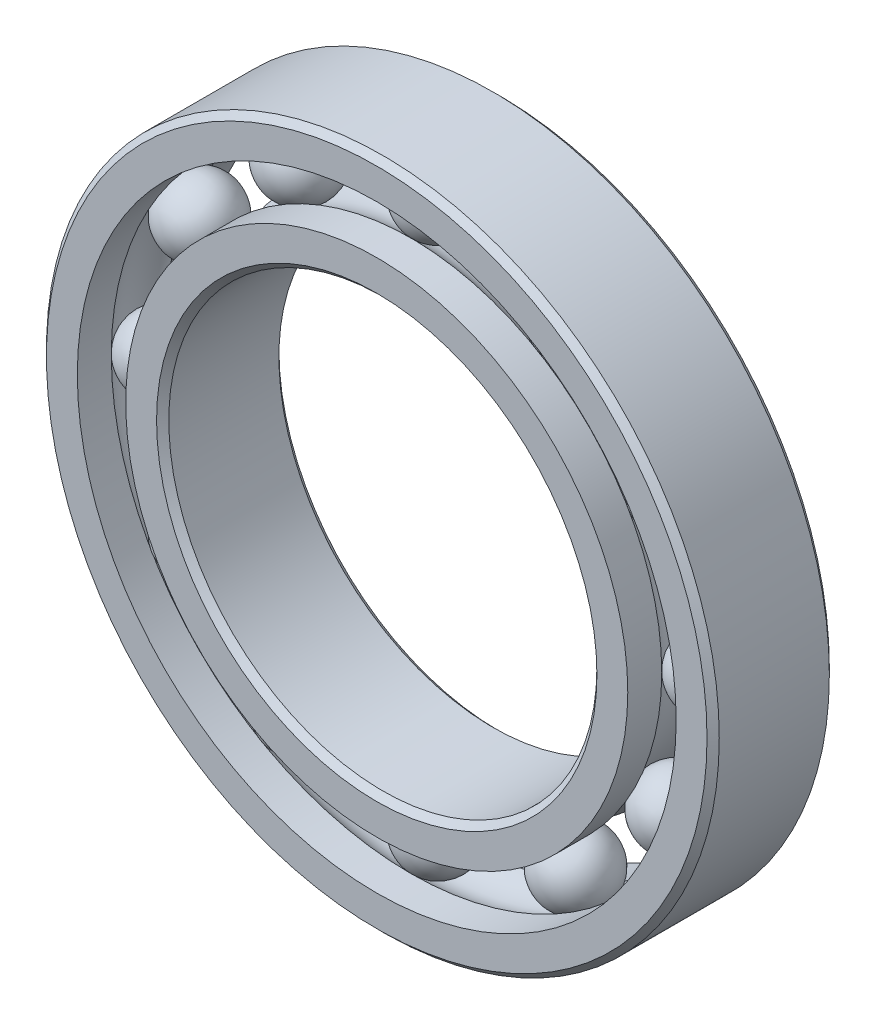
ISO-10303-21;
HEADER;
FILE_DESCRIPTION(('STEP AP214'),'2;1');
FILE_NAME('part.step','',(''),(''),'','','');
FILE_SCHEMA(('AUTOMOTIVE_DESIGN { 1 0 10303 214 1 1 1 1 }'));
ENDSEC;
DATA;
#1=APPLICATION_CONTEXT('core data for automotive mechanical design processes');
#2=APPLICATION_PROTOCOL_DEFINITION('international standard','automotive_design',2000,#1);
#3=PRODUCT_CONTEXT('',#1,'mechanical');
#4=PRODUCT('Part','Part','',(#3));
#5=PRODUCT_RELATED_PRODUCT_CATEGORY('part','',(#4));
#6=PRODUCT_DEFINITION_FORMATION('','',#4);
#7=PRODUCT_DEFINITION_CONTEXT('part definition',#1,'design');
#8=PRODUCT_DEFINITION('design','',#6,#7);
#9=PRODUCT_DEFINITION_SHAPE('','',#8);
#10=(LENGTH_UNIT() NAMED_UNIT(*) SI_UNIT(.MILLI.,.METRE.));
#11=(NAMED_UNIT(*) PLANE_ANGLE_UNIT() SI_UNIT($,.RADIAN.));
#12=(NAMED_UNIT(*) SI_UNIT($,.STERADIAN.) SOLID_ANGLE_UNIT());
#13=UNCERTAINTY_MEASURE_WITH_UNIT(LENGTH_MEASURE(1.E-05),#10,'distance_accuracy_value','');
#14=(GEOMETRIC_REPRESENTATION_CONTEXT(3) GLOBAL_UNCERTAINTY_ASSIGNED_CONTEXT((#13)) GLOBAL_UNIT_ASSIGNED_CONTEXT((#10,
#11,#12)) REPRESENTATION_CONTEXT('',''));
#15=CARTESIAN_POINT('',(0.,0.,0.));
#16=DIRECTION('',(0.,0.,1.));
#17=DIRECTION('',(1.,0.,0.));
#18=AXIS2_PLACEMENT_3D('',#15,#16,#17);
#19=CARTESIAN_POINT('',(-11.2498749999997,19.4853550787991,0.));
#20=DIRECTION('',(0.,0.,1.));
#21=DIRECTION('',(-0.499999999999989,0.866025403784445,0.));
#22=AXIS2_PLACEMENT_3D('',#19,#20,#21);
#23=SPHERICAL_SURFACE('',#22,2.97503656288057);
#24=CARTESIAN_POINT('',(-11.2498749999997,19.4853550787991,2.97503656288057));
#25=VERTEX_POINT('',#24);
#26=VERTEX_LOOP('',#25);
#27=FACE_BOUND('',#26,.T.);
#28=ADVANCED_FACE('F37',(#27),#23,.T.);
#29=CLOSED_SHELL('',(#28));
#30=MANIFOLD_SOLID_BREP('B2',#29);
#31=CARTESIAN_POINT('',(-19.4853550787988,11.2498750000002,0.));
#32=DIRECTION('',(0.,0.,1.));
#33=DIRECTION('',(-0.866025403784433,0.50000000000001,0.));
#34=AXIS2_PLACEMENT_3D('',#31,#32,#33);
#35=SPHERICAL_SURFACE('',#34,2.97503656288057);
#36=CARTESIAN_POINT('',(-19.4853550787988,11.2498750000002,2.97503656288057));
#37=VERTEX_POINT('',#36);
#38=VERTEX_LOOP('',#37);
#39=FACE_BOUND('',#38,.T.);
#40=ADVANCED_FACE('F57',(#39),#35,.T.);
#41=CLOSED_SHELL('',(#40));
#42=MANIFOLD_SOLID_BREP('B6',#41);
#43=CARTESIAN_POINT('',(-22.49975,2.35672371760907E-13,0.));
#44=DIRECTION('',(0.,0.,1.));
#45=DIRECTION('',(-1.,0.,0.));
#46=AXIS2_PLACEMENT_3D('',#43,#44,#45);
#47=SPHERICAL_SURFACE('',#46,2.97503656288057);
#48=CARTESIAN_POINT('',(-22.49975,2.35672371760907E-13,2.97503656288057));
#49=VERTEX_POINT('',#48);
#50=VERTEX_LOOP('',#49);
#51=FACE_BOUND('',#50,.T.);
#52=ADVANCED_FACE('F77',(#51),#47,.T.);
#53=CLOSED_SHELL('',(#52));
#54=MANIFOLD_SOLID_BREP('B33',#53);
#55=CARTESIAN_POINT('',(-19.485355078799,-11.2498749999998,0.));
#56=DIRECTION('',(0.,0.,1.));
#57=DIRECTION('',(-0.866025403784443,-0.499999999999992,0.));
#58=AXIS2_PLACEMENT_3D('',#55,#56,#57);
#59=SPHERICAL_SURFACE('',#58,2.97503656288057);
#60=CARTESIAN_POINT('',(-19.485355078799,-11.2498749999998,2.97503656288057));
#61=VERTEX_POINT('',#60);
#62=VERTEX_LOOP('',#61);
#63=FACE_BOUND('',#62,.T.);
#64=ADVANCED_FACE('F97',(#63),#59,.T.);
#65=CLOSED_SHELL('',(#64));
#66=MANIFOLD_SOLID_BREP('B53',#65);
#67=CARTESIAN_POINT('',(-11.2498750000002,-19.4853550787988,0.));
#68=DIRECTION('',(0.,0.,1.));
#69=DIRECTION('',(-0.500000000000007,-0.866025403784435,0.));
#70=AXIS2_PLACEMENT_3D('',#67,#68,#69);
#71=SPHERICAL_SURFACE('',#70,2.97503656288057);
#72=CARTESIAN_POINT('',(-11.2498750000002,-19.4853550787988,2.97503656288057));
#73=VERTEX_POINT('',#72);
#74=VERTEX_LOOP('',#73);
#75=FACE_BOUND('',#74,.T.);
#76=ADVANCED_FACE('F117',(#75),#71,.T.);
#77=CLOSED_SHELL('',(#76));
#78=MANIFOLD_SOLID_BREP('B73',#77);
#79=CARTESIAN_POINT('',(-1.57114914507272E-13,-22.49975,0.));
#80=DIRECTION('',(0.,0.,1.));
#81=DIRECTION('',(0.,-1.,0.));
#82=AXIS2_PLACEMENT_3D('',#79,#80,#81);
#83=SPHERICAL_SURFACE('',#82,2.97503656288057);
#84=CARTESIAN_POINT('',(-1.57114914507272E-13,-22.49975,2.97503656288057));
#85=VERTEX_POINT('',#84);
#86=VERTEX_LOOP('',#85);
#87=FACE_BOUND('',#86,.T.);
#88=ADVANCED_FACE('F137',(#87),#83,.T.);
#89=CLOSED_SHELL('',(#88));
#90=MANIFOLD_SOLID_BREP('B93',#89);
#91=CARTESIAN_POINT('',(11.2498749999999,-19.485355078799,0.));
#92=DIRECTION('',(0.,0.,1.));
#93=DIRECTION('',(0.499999999999995,-0.866025403784442,0.));
#94=AXIS2_PLACEMENT_3D('',#91,#92,#93);
#95=SPHERICAL_SURFACE('',#94,2.97503656288057);
#96=CARTESIAN_POINT('',(11.2498749999999,-19.485355078799,2.97503656288057));
#97=VERTEX_POINT('',#96);
#98=VERTEX_LOOP('',#97);
#99=FACE_BOUND('',#98,.T.);
#100=ADVANCED_FACE('F157',(#99),#95,.T.);
#101=CLOSED_SHELL('',(#100));
#102=MANIFOLD_SOLID_BREP('B113',#101);
#103=CARTESIAN_POINT('',(19.4853550787989,-11.2498750000001,0.));
#104=DIRECTION('',(0.,0.,1.));
#105=DIRECTION('',(0.866025403784436,-0.500000000000004,0.));
#106=AXIS2_PLACEMENT_3D('',#103,#104,#105);
#107=SPHERICAL_SURFACE('',#106,2.97503656288057);
#108=CARTESIAN_POINT('',(19.4853550787989,-11.2498750000001,2.97503656288057));
#109=VERTEX_POINT('',#108);
#110=VERTEX_LOOP('',#109);
#111=FACE_BOUND('',#110,.T.);
#112=ADVANCED_FACE('F177',(#111),#107,.T.);
#113=CLOSED_SHELL('',(#112));
#114=MANIFOLD_SOLID_BREP('B133',#113);
#115=CARTESIAN_POINT('',(22.49975,0.,0.));
#116=DIRECTION('',(0.,0.,1.));
#117=DIRECTION('',(1.,0.,0.));
#118=AXIS2_PLACEMENT_3D('',#115,#116,#117);
#119=SPHERICAL_SURFACE('',#118,2.97503656288057);
#120=CARTESIAN_POINT('',(22.49975,0.,2.97503656288057));
#121=VERTEX_POINT('',#120);
#122=VERTEX_LOOP('',#121);
#123=FACE_BOUND('',#122,.T.);
#124=ADVANCED_FACE('F197',(#123),#119,.T.);
#125=CLOSED_SHELL('',(#124));
#126=MANIFOLD_SOLID_BREP('B153',#125);
#127=CARTESIAN_POINT('',(19.4853550787989,11.249875,0.));
#128=DIRECTION('',(0.,0.,1.));
#129=DIRECTION('',(0.86602540378444,0.499999999999998,0.));
#130=AXIS2_PLACEMENT_3D('',#127,#128,#129);
#131=SPHERICAL_SURFACE('',#130,2.97503656288057);
#132=CARTESIAN_POINT('',(19.4853550787989,11.249875,2.97503656288057));
#133=VERTEX_POINT('',#132);
#134=VERTEX_LOOP('',#133);
#135=FACE_BOUND('',#134,.T.);
#136=ADVANCED_FACE('F217',(#135),#131,.T.);
#137=CLOSED_SHELL('',(#136));
#138=MANIFOLD_SOLID_BREP('B173',#137);
#139=CARTESIAN_POINT('',(11.249875,19.4853550787989,0.));
#140=DIRECTION('',(0.,0.,1.));
#141=DIRECTION('',(0.500000000000001,0.866025403784438,0.));
#142=AXIS2_PLACEMENT_3D('',#139,#140,#141);
#143=SPHERICAL_SURFACE('',#142,2.97503656288057);
#144=CARTESIAN_POINT('',(11.249875,19.4853550787989,2.97503656288057));
#145=VERTEX_POINT('',#144);
#146=VERTEX_LOOP('',#145);
#147=FACE_BOUND('',#146,.T.);
#148=ADVANCED_FACE('F237',(#147),#143,.T.);
#149=CLOSED_SHELL('',(#148));
#150=MANIFOLD_SOLID_BREP('B193',#149);
#151=CARTESIAN_POINT('',(0.,22.49975,0.));
#152=DIRECTION('',(0.,0.,1.));
#153=DIRECTION('',(0.,1.,0.));
#154=AXIS2_PLACEMENT_3D('',#151,#152,#153);
#155=SPHERICAL_SURFACE('',#154,2.97503656288057);
#156=CARTESIAN_POINT('',(0.,22.49975,2.97503656288057));
#157=VERTEX_POINT('',#156);
#158=VERTEX_LOOP('',#157);
#159=FACE_BOUND('',#158,.T.);
#160=ADVANCED_FACE('F259',(#159),#155,.T.);
#161=CLOSED_SHELL('',(#160));
#162=MANIFOLD_SOLID_BREP('B213',#161);
#163=CARTESIAN_POINT('',(0.,20.521728021978,5.));
#164=DIRECTION('',(0.,0.,-1.));
#165=DIRECTION('',(-1.,0.,0.));
#166=AXIS2_PLACEMENT_3D('',#163,#164,#165);
#167=PLANE('',#166);
#168=CARTESIAN_POINT('',(0.,0.,5.));
#169=DIRECTION('',(0.,0.,1.));
#170=DIRECTION('',(1.,0.,0.));
#171=AXIS2_PLACEMENT_3D('',#168,#169,#170);
#172=CIRCLE('',#171,17.9995);
#173=CARTESIAN_POINT('',(17.9995,0.,5.));
#174=VERTEX_POINT('',#173);
#175=EDGE_CURVE('E306',#174,#174,#172,.T.);
#176=ORIENTED_EDGE('',*,*,#175,.F.);
#177=EDGE_LOOP('',(#176));
#178=FACE_BOUND('',#177,.T.);
#179=CARTESIAN_POINT('',(0.,0.,5.));
#180=DIRECTION('',(0.,0.,1.));
#181=DIRECTION('',(1.,0.,0.));
#182=AXIS2_PLACEMENT_3D('',#179,#180,#181);
#183=CIRCLE('',#182,20.521728021978);
#184=CARTESIAN_POINT('',(20.521728021978,0.,5.));
#185=VERTEX_POINT('',#184);
#186=EDGE_CURVE('E258',#185,#185,#183,.T.);
#187=ORIENTED_EDGE('',*,*,#186,.T.);
#188=EDGE_LOOP('',(#187));
#189=FACE_BOUND('',#188,.T.);
#190=ADVANCED_FACE('F278',(#178,#189),#167,.F.);
#191=CARTESIAN_POINT('',(0.,0.,5.));
#192=DIRECTION('',(0.,0.,1.));
#193=DIRECTION('',(1.,0.,0.));
#194=AXIS2_PLACEMENT_3D('',#191,#192,#193);
#195=CYLINDRICAL_SURFACE('',#194,20.521728021978);
#196=ORIENTED_EDGE('',*,*,#186,.F.);
#197=EDGE_LOOP('',(#196));
#198=FACE_BOUND('',#197,.T.);
#199=CARTESIAN_POINT('',(0.,0.,2.22222222222222));
#200=DIRECTION('',(0.,0.,1.));
#201=DIRECTION('',(1.,0.,0.));
#202=AXIS2_PLACEMENT_3D('',#199,#200,#201);
#203=CIRCLE('',#202,20.521728021978);
#204=CARTESIAN_POINT('',(20.521728021978,0.,2.22222222222222));
#205=VERTEX_POINT('',#204);
#206=EDGE_CURVE('E284',#205,#205,#203,.T.);
#207=ORIENTED_EDGE('',*,*,#206,.T.);
#208=EDGE_LOOP('',(#207));
#209=FACE_BOUND('',#208,.T.);
#210=ADVANCED_FACE('F313',(#198,#209),#195,.T.);
#211=CARTESIAN_POINT('',(0.,0.,0.));
#212=DIRECTION('',(0.,0.,1.));
#213=DIRECTION('',(1.,0.,0.));
#214=AXIS2_PLACEMENT_3D('',#211,#212,#213);
#215=TOROIDAL_SURFACE('',#214,22.49975,2.97503656288057);
#216=ORIENTED_EDGE('',*,*,#206,.F.);
#217=EDGE_LOOP('',(#216));
#218=FACE_BOUND('',#217,.T.);
#219=CARTESIAN_POINT('',(0.,0.,-2.22222222222223));
#220=DIRECTION('',(0.,0.,1.));
#221=DIRECTION('',(1.,0.,0.));
#222=AXIS2_PLACEMENT_3D('',#219,#220,#221);
#223=CIRCLE('',#222,20.521728021978);
#224=CARTESIAN_POINT('',(20.521728021978,0.,-2.22222222222223));
#225=VERTEX_POINT('',#224);
#226=EDGE_CURVE('E288',#225,#225,#223,.T.);
#227=ORIENTED_EDGE('',*,*,#226,.T.);
#228=EDGE_LOOP('',(#227));
#229=FACE_BOUND('',#228,.T.);
#230=ADVANCED_FACE('F317',(#218,#229),#215,.F.);
#231=CARTESIAN_POINT('',(0.,0.,5.));
#232=DIRECTION('',(0.,0.,1.));
#233=DIRECTION('',(1.,0.,0.));
#234=AXIS2_PLACEMENT_3D('',#231,#232,#233);
#235=CYLINDRICAL_SURFACE('',#234,20.521728021978);
#236=ORIENTED_EDGE('',*,*,#226,.F.);
#237=EDGE_LOOP('',(#236));
#238=FACE_BOUND('',#237,.T.);
#239=CARTESIAN_POINT('',(0.,0.,-5.00000000000001));
#240=DIRECTION('',(0.,0.,1.));
#241=DIRECTION('',(1.,0.,0.));
#242=AXIS2_PLACEMENT_3D('',#239,#240,#241);
#243=CIRCLE('',#242,20.521728021978);
#244=CARTESIAN_POINT('',(20.521728021978,0.,-5.00000000000001));
#245=VERTEX_POINT('',#244);
#246=EDGE_CURVE('E292',#245,#245,#243,.T.);
#247=ORIENTED_EDGE('',*,*,#246,.T.);
#248=EDGE_LOOP('',(#247));
#249=FACE_BOUND('',#248,.T.);
#250=ADVANCED_FACE('F322',(#238,#249),#235,.T.);
#251=CARTESIAN_POINT('',(0.,17.9995,-5.00000000000001));
#252=DIRECTION('',(0.,0.,1.));
#253=DIRECTION('',(1.,0.,0.));
#254=AXIS2_PLACEMENT_3D('',#251,#252,#253);
#255=PLANE('',#254);
#256=ORIENTED_EDGE('',*,*,#246,.F.);
#257=EDGE_LOOP('',(#256));
#258=FACE_BOUND('',#257,.T.);
#259=CARTESIAN_POINT('',(0.,0.,-5.00000000000001));
#260=DIRECTION('',(0.,0.,1.));
#261=DIRECTION('',(1.,0.,0.));
#262=AXIS2_PLACEMENT_3D('',#259,#260,#261);
#263=CIRCLE('',#262,17.9995);
#264=CARTESIAN_POINT('',(17.9995,0.,-5.00000000000001));
#265=VERTEX_POINT('',#264);
#266=EDGE_CURVE('E297',#265,#265,#263,.T.);
#267=ORIENTED_EDGE('',*,*,#266,.T.);
#268=EDGE_LOOP('',(#267));
#269=FACE_BOUND('',#268,.T.);
#270=ADVANCED_FACE('F328',(#258,#269),#255,.F.);
#271=CARTESIAN_POINT('',(0.,0.,-4.5));
#272=DIRECTION('',(0.,0.,-1.));
#273=DIRECTION('',(-1.,0.,0.));
#274=AXIS2_PLACEMENT_3D('',#271,#272,#273);
#275=CONICAL_SURFACE('',#274,17.4995,0.785398163397442);
#276=ORIENTED_EDGE('',*,*,#266,.F.);
#277=EDGE_LOOP('',(#276));
#278=FACE_BOUND('',#277,.T.);
#279=CARTESIAN_POINT('',(0.,0.,-4.5));
#280=DIRECTION('',(0.,0.,1.));
#281=DIRECTION('',(1.,0.,0.));
#282=AXIS2_PLACEMENT_3D('',#279,#280,#281);
#283=CIRCLE('',#282,17.4995);
#284=CARTESIAN_POINT('',(17.4995,0.,-4.5));
#285=VERTEX_POINT('',#284);
#286=EDGE_CURVE('E300',#285,#285,#283,.T.);
#287=ORIENTED_EDGE('',*,*,#286,.T.);
#288=EDGE_LOOP('',(#287));
#289=FACE_BOUND('',#288,.T.);
#290=ADVANCED_FACE('F332',(#278,#289),#275,.F.);
#291=CARTESIAN_POINT('',(0.,0.,5.));
#292=DIRECTION('',(0.,0.,1.));
#293=DIRECTION('',(1.,0.,0.));
#294=AXIS2_PLACEMENT_3D('',#291,#292,#293);
#295=CYLINDRICAL_SURFACE('',#294,17.4995);
#296=ORIENTED_EDGE('',*,*,#286,.F.);
#297=EDGE_LOOP('',(#296));
#298=FACE_BOUND('',#297,.T.);
#299=CARTESIAN_POINT('',(0.,0.,4.50000000000001));
#300=DIRECTION('',(0.,0.,1.));
#301=DIRECTION('',(1.,0.,0.));
#302=AXIS2_PLACEMENT_3D('',#299,#300,#301);
#303=CIRCLE('',#302,17.4995);
#304=CARTESIAN_POINT('',(17.4995,0.,4.50000000000001));
#305=VERTEX_POINT('',#304);
#306=EDGE_CURVE('E303',#305,#305,#303,.T.);
#307=ORIENTED_EDGE('',*,*,#306,.T.);
#308=EDGE_LOOP('',(#307));
#309=FACE_BOUND('',#308,.T.);
#310=ADVANCED_FACE('F336',(#298,#309),#295,.F.);
#311=CARTESIAN_POINT('',(0.,0.,5.));
#312=DIRECTION('',(0.,0.,1.));
#313=DIRECTION('',(1.,0.,0.));
#314=AXIS2_PLACEMENT_3D('',#311,#312,#313);
#315=CONICAL_SURFACE('',#314,17.9995,0.785398163397452);
#316=ORIENTED_EDGE('',*,*,#306,.F.);
#317=EDGE_LOOP('',(#316));
#318=FACE_BOUND('',#317,.T.);
#319=ORIENTED_EDGE('',*,*,#175,.T.);
#320=EDGE_LOOP('',(#319));
#321=FACE_BOUND('',#320,.T.);
#322=ADVANCED_FACE('F310',(#318,#321),#315,.F.);
#323=CLOSED_SHELL('',(#190,#210,#230,#250,#270,#290,#310,#322));
#324=MANIFOLD_SOLID_BREP('B233',#323);
#325=CARTESIAN_POINT('',(0.,0.,4.5));
#326=DIRECTION('',(0.,0.,-1.));
#327=DIRECTION('',(-1.,0.,0.));
#328=AXIS2_PLACEMENT_3D('',#325,#326,#327);
#329=CONICAL_SURFACE('',#328,27.5,0.785398163397446);
#330=CARTESIAN_POINT('',(0.,0.,5.));
#331=DIRECTION('',(0.,0.,1.));
#332=DIRECTION('',(1.,0.,0.));
#333=AXIS2_PLACEMENT_3D('',#330,#331,#332);
#334=CIRCLE('',#333,27.);
#335=CARTESIAN_POINT('',(27.,0.,5.));
#336=VERTEX_POINT('',#335);
#337=EDGE_CURVE('E427',#336,#336,#334,.T.);
#338=ORIENTED_EDGE('',*,*,#337,.F.);
#339=EDGE_LOOP('',(#338));
#340=FACE_BOUND('',#339,.T.);
#341=CARTESIAN_POINT('',(0.,0.,4.5));
#342=DIRECTION('',(0.,0.,1.));
#343=DIRECTION('',(1.,0.,0.));
#344=AXIS2_PLACEMENT_3D('',#341,#342,#343);
#345=CIRCLE('',#344,27.5);
#346=CARTESIAN_POINT('',(27.5,0.,4.5));
#347=VERTEX_POINT('',#346);
#348=EDGE_CURVE('E277',#347,#347,#345,.T.);
#349=ORIENTED_EDGE('',*,*,#348,.T.);
#350=EDGE_LOOP('',(#349));
#351=FACE_BOUND('',#350,.T.);
#352=ADVANCED_FACE('F399',(#340,#351),#329,.T.);
#353=CARTESIAN_POINT('',(0.,0.,5.));
#354=DIRECTION('',(0.,0.,1.));
#355=DIRECTION('',(1.,0.,0.));
#356=AXIS2_PLACEMENT_3D('',#353,#354,#355);
#357=CYLINDRICAL_SURFACE('',#356,27.5);
#358=ORIENTED_EDGE('',*,*,#348,.F.);
#359=EDGE_LOOP('',(#358));
#360=FACE_BOUND('',#359,.T.);
#361=CARTESIAN_POINT('',(0.,0.,-4.5));
#362=DIRECTION('',(0.,0.,1.));
#363=DIRECTION('',(1.,0.,0.));
#364=AXIS2_PLACEMENT_3D('',#361,#362,#363);
#365=CIRCLE('',#364,27.5);
#366=CARTESIAN_POINT('',(27.5,0.,-4.5));
#367=VERTEX_POINT('',#366);
#368=EDGE_CURVE('E405',#367,#367,#365,.T.);
#369=ORIENTED_EDGE('',*,*,#368,.T.);
#370=EDGE_LOOP('',(#369));
#371=FACE_BOUND('',#370,.T.);
#372=ADVANCED_FACE('F434',(#360,#371),#357,.T.);
#373=CARTESIAN_POINT('',(0.,0.,-5.00000000000001));
#374=DIRECTION('',(0.,0.,1.));
#375=DIRECTION('',(1.,0.,0.));
#376=AXIS2_PLACEMENT_3D('',#373,#374,#375);
#377=CONICAL_SURFACE('',#376,27.,0.785398163397445);
#378=ORIENTED_EDGE('',*,*,#368,.F.);
#379=EDGE_LOOP('',(#378));
#380=FACE_BOUND('',#379,.T.);
#381=CARTESIAN_POINT('',(0.,0.,-5.00000000000001));
#382=DIRECTION('',(0.,0.,1.));
#383=DIRECTION('',(1.,0.,0.));
#384=AXIS2_PLACEMENT_3D('',#381,#382,#383);
#385=CIRCLE('',#384,27.);
#386=CARTESIAN_POINT('',(27.,0.,-5.00000000000001));
#387=VERTEX_POINT('',#386);
#388=EDGE_CURVE('E409',#387,#387,#385,.T.);
#389=ORIENTED_EDGE('',*,*,#388,.T.);
#390=EDGE_LOOP('',(#389));
#391=FACE_BOUND('',#390,.T.);
#392=ADVANCED_FACE('F438',(#380,#391),#377,.T.);
#393=CARTESIAN_POINT('',(0.,27.,-5.));
#394=DIRECTION('',(0.,0.,1.));
#395=DIRECTION('',(1.,0.,0.));
#396=AXIS2_PLACEMENT_3D('',#393,#394,#395);
#397=PLANE('',#396);
#398=ORIENTED_EDGE('',*,*,#388,.F.);
#399=EDGE_LOOP('',(#398));
#400=FACE_BOUND('',#399,.T.);
#401=CARTESIAN_POINT('',(0.,0.,-5.00000000000001));
#402=DIRECTION('',(0.,0.,1.));
#403=DIRECTION('',(1.,0.,0.));
#404=AXIS2_PLACEMENT_3D('',#401,#402,#403);
#405=CIRCLE('',#404,24.477771978022);
#406=CARTESIAN_POINT('',(24.477771978022,0.,-5.00000000000001));
#407=VERTEX_POINT('',#406);
#408=EDGE_CURVE('E413',#407,#407,#405,.T.);
#409=ORIENTED_EDGE('',*,*,#408,.T.);
#410=EDGE_LOOP('',(#409));
#411=FACE_BOUND('',#410,.T.);
#412=ADVANCED_FACE('F443',(#400,#411),#397,.F.);
#413=CARTESIAN_POINT('',(0.,0.,5.));
#414=DIRECTION('',(0.,0.,1.));
#415=DIRECTION('',(1.,0.,0.));
#416=AXIS2_PLACEMENT_3D('',#413,#414,#415);
#417=CYLINDRICAL_SURFACE('',#416,24.477771978022);
#418=ORIENTED_EDGE('',*,*,#408,.F.);
#419=EDGE_LOOP('',(#418));
#420=FACE_BOUND('',#419,.T.);
#421=CARTESIAN_POINT('',(0.,0.,-2.22222222222222));
#422=DIRECTION('',(0.,0.,1.));
#423=DIRECTION('',(1.,0.,0.));
#424=AXIS2_PLACEMENT_3D('',#421,#422,#423);
#425=CIRCLE('',#424,24.477771978022);
#426=CARTESIAN_POINT('',(24.477771978022,0.,-2.22222222222222));
#427=VERTEX_POINT('',#426);
#428=EDGE_CURVE('E418',#427,#427,#425,.T.);
#429=ORIENTED_EDGE('',*,*,#428,.T.);
#430=EDGE_LOOP('',(#429));
#431=FACE_BOUND('',#430,.T.);
#432=ADVANCED_FACE('F449',(#420,#431),#417,.F.);
#433=CARTESIAN_POINT('',(0.,0.,0.));
#434=DIRECTION('',(0.,0.,1.));
#435=DIRECTION('',(1.,0.,0.));
#436=AXIS2_PLACEMENT_3D('',#433,#434,#435);
#437=TOROIDAL_SURFACE('',#436,22.49975,2.97503656288057);
#438=ORIENTED_EDGE('',*,*,#428,.F.);
#439=EDGE_LOOP('',(#438));
#440=FACE_BOUND('',#439,.T.);
#441=CARTESIAN_POINT('',(0.,0.,2.22222222222222));
#442=DIRECTION('',(0.,0.,1.));
#443=DIRECTION('',(1.,0.,0.));
#444=AXIS2_PLACEMENT_3D('',#441,#442,#443);
#445=CIRCLE('',#444,24.477771978022);
#446=CARTESIAN_POINT('',(24.477771978022,0.,2.22222222222222));
#447=VERTEX_POINT('',#446);
#448=EDGE_CURVE('E421',#447,#447,#445,.T.);
#449=ORIENTED_EDGE('',*,*,#448,.T.);
#450=EDGE_LOOP('',(#449));
#451=FACE_BOUND('',#450,.T.);
#452=ADVANCED_FACE('F453',(#440,#451),#437,.F.);
#453=CARTESIAN_POINT('',(0.,0.,5.));
#454=DIRECTION('',(0.,0.,1.));
#455=DIRECTION('',(1.,0.,0.));
#456=AXIS2_PLACEMENT_3D('',#453,#454,#455);
#457=CYLINDRICAL_SURFACE('',#456,24.477771978022);
#458=ORIENTED_EDGE('',*,*,#448,.F.);
#459=EDGE_LOOP('',(#458));
#460=FACE_BOUND('',#459,.T.);
#461=CARTESIAN_POINT('',(0.,0.,5.));
#462=DIRECTION('',(0.,0.,1.));
#463=DIRECTION('',(1.,0.,0.));
#464=AXIS2_PLACEMENT_3D('',#461,#462,#463);
#465=CIRCLE('',#464,24.477771978022);
#466=CARTESIAN_POINT('',(24.477771978022,0.,5.));
#467=VERTEX_POINT('',#466);
#468=EDGE_CURVE('E424',#467,#467,#465,.T.);
#469=ORIENTED_EDGE('',*,*,#468,.T.);
#470=EDGE_LOOP('',(#469));
#471=FACE_BOUND('',#470,.T.);
#472=ADVANCED_FACE('F457',(#460,#471),#457,.F.);
#473=CARTESIAN_POINT('',(0.,27.,5.));
#474=DIRECTION('',(0.,0.,-1.));
#475=DIRECTION('',(-1.,0.,0.));
#476=AXIS2_PLACEMENT_3D('',#473,#474,#475);
#477=PLANE('',#476);
#478=ORIENTED_EDGE('',*,*,#468,.F.);
#479=EDGE_LOOP('',(#478));
#480=FACE_BOUND('',#479,.T.);
#481=ORIENTED_EDGE('',*,*,#337,.T.);
#482=EDGE_LOOP('',(#481));
#483=FACE_BOUND('',#482,.T.);
#484=ADVANCED_FACE('F431',(#480,#483),#477,.F.);
#485=CLOSED_SHELL('',(#352,#372,#392,#412,#432,#452,#472,#484));
#486=MANIFOLD_SOLID_BREP('B253',#485);
#487=ADVANCED_BREP_SHAPE_REPRESENTATION('',(#18,#30,#42,#54,#66,#78,#90,#102,#114,#126,#138,
#150,#162,#324,#486),#14);
#488=SHAPE_DEFINITION_REPRESENTATION(#9,#487);
ENDSEC;
END-ISO-10303-21;
